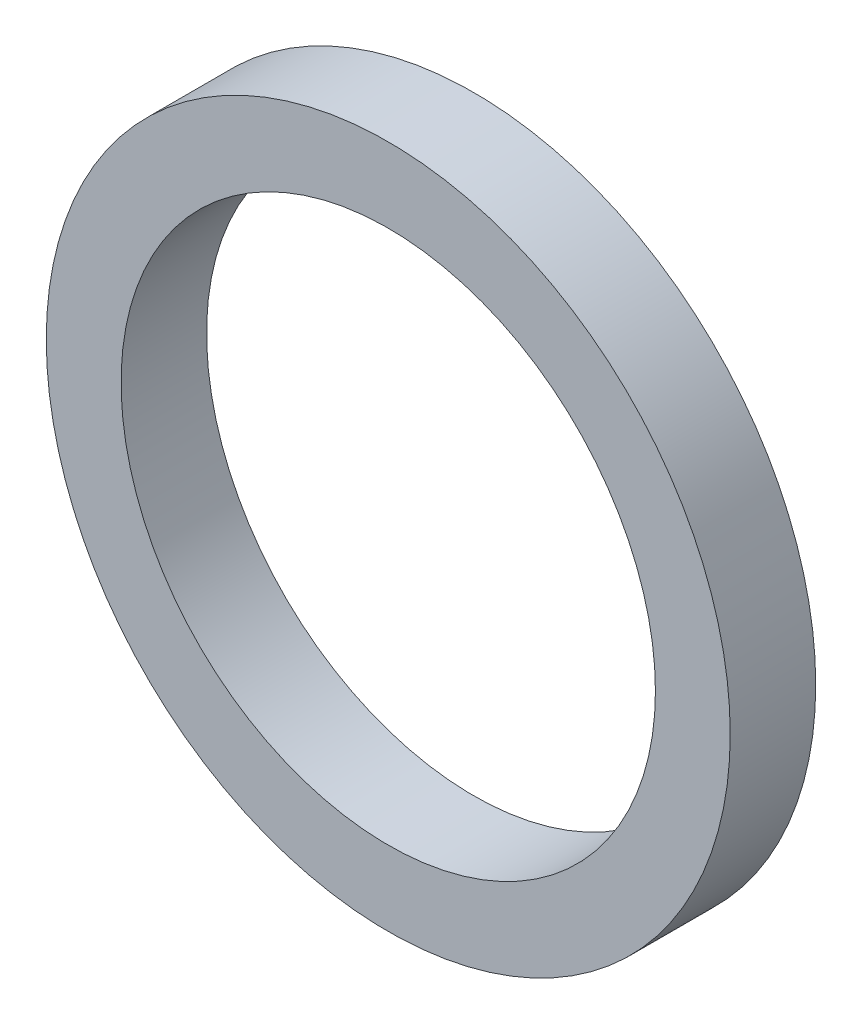
ISO-10303-21;
HEADER;
FILE_DESCRIPTION(('STEP AP214'),'2;1');
FILE_NAME('part.step','',(''),(''),'','','');
FILE_SCHEMA(('AUTOMOTIVE_DESIGN { 1 0 10303 214 1 1 1 1 }'));
ENDSEC;
DATA;
#1=APPLICATION_CONTEXT('core data for automotive mechanical design processes');
#2=APPLICATION_PROTOCOL_DEFINITION('international standard','automotive_design',2000,#1);
#3=PRODUCT_CONTEXT('',#1,'mechanical');
#4=PRODUCT('Part','Part','',(#3));
#5=PRODUCT_RELATED_PRODUCT_CATEGORY('part','',(#4));
#6=PRODUCT_DEFINITION_FORMATION('','',#4);
#7=PRODUCT_DEFINITION_CONTEXT('part definition',#1,'design');
#8=PRODUCT_DEFINITION('design','',#6,#7);
#9=PRODUCT_DEFINITION_SHAPE('','',#8);
#10=(LENGTH_UNIT() NAMED_UNIT(*) SI_UNIT(.MILLI.,.METRE.));
#11=(NAMED_UNIT(*) PLANE_ANGLE_UNIT() SI_UNIT($,.RADIAN.));
#12=(NAMED_UNIT(*) SI_UNIT($,.STERADIAN.) SOLID_ANGLE_UNIT());
#13=UNCERTAINTY_MEASURE_WITH_UNIT(LENGTH_MEASURE(1.E-05),#10,'distance_accuracy_value','');
#14=(GEOMETRIC_REPRESENTATION_CONTEXT(3) GLOBAL_UNCERTAINTY_ASSIGNED_CONTEXT((#13)) GLOBAL_UNIT_ASSIGNED_CONTEXT((#10,
#11,#12)) REPRESENTATION_CONTEXT('',''));
#15=CARTESIAN_POINT('',(0.,0.,0.));
#16=DIRECTION('',(0.,0.,1.));
#17=DIRECTION('',(1.,0.,0.));
#18=AXIS2_PLACEMENT_3D('',#15,#16,#17);
#19=CARTESIAN_POINT('',(0.,0.,4.));
#20=DIRECTION('',(0.,0.,1.));
#21=DIRECTION('',(1.,0.,0.));
#22=AXIS2_PLACEMENT_3D('',#19,#20,#21);
#23=PLANE('',#22);
#24=CARTESIAN_POINT('',(0.,0.,4.));
#25=DIRECTION('',(0.,0.,1.));
#26=DIRECTION('',(1.,0.,0.));
#27=AXIS2_PLACEMENT_3D('',#24,#25,#26);
#28=CIRCLE('',#27,16.);
#29=CARTESIAN_POINT('',(16.,0.,4.));
#30=VERTEX_POINT('',#29);
#31=EDGE_CURVE('E10',#30,#30,#28,.T.);
#32=ORIENTED_EDGE('',*,*,#31,.T.);
#33=EDGE_LOOP('',(#32));
#34=FACE_BOUND('',#33,.T.);
#35=CARTESIAN_POINT('',(0.,0.,4.));
#36=DIRECTION('',(0.,0.,1.));
#37=DIRECTION('',(1.,0.,0.));
#38=AXIS2_PLACEMENT_3D('',#35,#36,#37);
#39=CIRCLE('',#38,12.5);
#40=CARTESIAN_POINT('',(12.5,0.,4.));
#41=VERTEX_POINT('',#40);
#42=EDGE_CURVE('E42',#41,#41,#39,.T.);
#43=ORIENTED_EDGE('',*,*,#42,.F.);
#44=EDGE_LOOP('',(#43));
#45=FACE_BOUND('',#44,.T.);
#46=ADVANCED_FACE('F31',(#34,#45),#23,.T.);
#47=CARTESIAN_POINT('',(0.,0.,0.));
#48=DIRECTION('',(0.,0.,1.));
#49=DIRECTION('',(1.,0.,0.));
#50=AXIS2_PLACEMENT_3D('',#47,#48,#49);
#51=PLANE('',#50);
#52=CARTESIAN_POINT('',(0.,0.,0.));
#53=DIRECTION('',(0.,0.,1.));
#54=DIRECTION('',(1.,0.,0.));
#55=AXIS2_PLACEMENT_3D('',#52,#53,#54);
#56=CIRCLE('',#55,16.);
#57=CARTESIAN_POINT('',(16.,0.,0.));
#58=VERTEX_POINT('',#57);
#59=EDGE_CURVE('E35',#58,#58,#56,.T.);
#60=ORIENTED_EDGE('',*,*,#59,.F.);
#61=EDGE_LOOP('',(#60));
#62=FACE_BOUND('',#61,.T.);
#63=CARTESIAN_POINT('',(0.,0.,0.));
#64=DIRECTION('',(0.,0.,1.));
#65=DIRECTION('',(1.,0.,0.));
#66=AXIS2_PLACEMENT_3D('',#63,#64,#65);
#67=CIRCLE('',#66,12.5);
#68=CARTESIAN_POINT('',(12.5,0.,0.));
#69=VERTEX_POINT('',#68);
#70=EDGE_CURVE('E44',#69,#69,#67,.T.);
#71=ORIENTED_EDGE('',*,*,#70,.T.);
#72=EDGE_LOOP('',(#71));
#73=FACE_BOUND('',#72,.T.);
#74=ADVANCED_FACE('F54',(#62,#73),#51,.F.);
#75=CARTESIAN_POINT('',(0.,0.,4.));
#76=DIRECTION('',(0.,0.,-1.));
#77=DIRECTION('',(-1.,0.,0.));
#78=AXIS2_PLACEMENT_3D('',#75,#76,#77);
#79=CYLINDRICAL_SURFACE('',#78,16.);
#80=ORIENTED_EDGE('',*,*,#31,.F.);
#81=EDGE_LOOP('',(#80));
#82=FACE_BOUND('',#81,.T.);
#83=ORIENTED_EDGE('',*,*,#59,.T.);
#84=EDGE_LOOP('',(#83));
#85=FACE_BOUND('',#84,.T.);
#86=ADVANCED_FACE('F33',(#82,#85),#79,.T.);
#87=CARTESIAN_POINT('',(0.,0.,4.));
#88=DIRECTION('',(0.,0.,-1.));
#89=DIRECTION('',(-1.,0.,0.));
#90=AXIS2_PLACEMENT_3D('',#87,#88,#89);
#91=CYLINDRICAL_SURFACE('',#90,12.5);
#92=ORIENTED_EDGE('',*,*,#42,.T.);
#93=EDGE_LOOP('',(#92));
#94=FACE_BOUND('',#93,.T.);
#95=ORIENTED_EDGE('',*,*,#70,.F.);
#96=EDGE_LOOP('',(#95));
#97=FACE_BOUND('',#96,.T.);
#98=ADVANCED_FACE('F50',(#94,#97),#91,.F.);
#99=CLOSED_SHELL('',(#46,#74,#86,#98));
#100=MANIFOLD_SOLID_BREP('B2',#99);
#101=ADVANCED_BREP_SHAPE_REPRESENTATION('',(#18,#100),#14);
#102=SHAPE_DEFINITION_REPRESENTATION(#9,#101);
ENDSEC;
END-ISO-10303-21;
